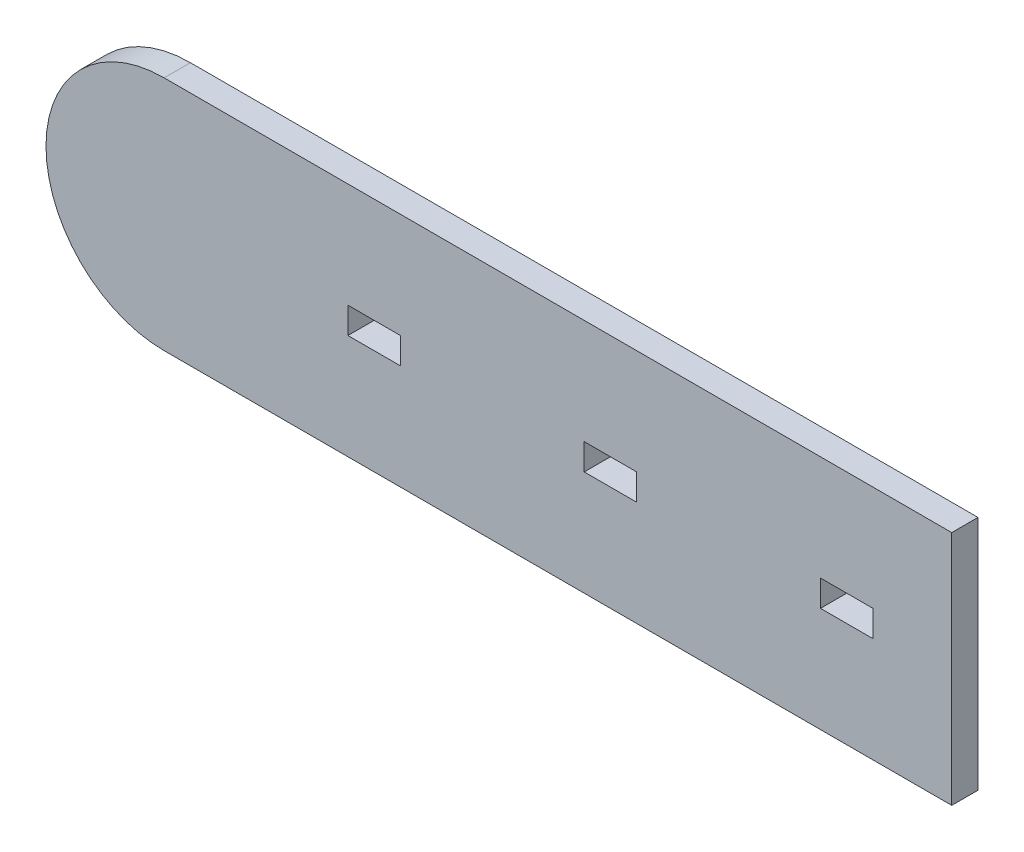
ISO-10303-21;
HEADER;
FILE_DESCRIPTION(('STEP AP214'),'2;1');
FILE_NAME('part.step','',(''),(''),'','','');
FILE_SCHEMA(('AUTOMOTIVE_DESIGN { 1 0 10303 214 1 1 1 1 }'));
ENDSEC;
DATA;
#1=APPLICATION_CONTEXT('core data for automotive mechanical design processes');
#2=APPLICATION_PROTOCOL_DEFINITION('international standard','automotive_design',2000,#1);
#3=PRODUCT_CONTEXT('',#1,'mechanical');
#4=PRODUCT('Part','Part','',(#3));
#5=PRODUCT_RELATED_PRODUCT_CATEGORY('part','',(#4));
#6=PRODUCT_DEFINITION_FORMATION('','',#4);
#7=PRODUCT_DEFINITION_CONTEXT('part definition',#1,'design');
#8=PRODUCT_DEFINITION('design','',#6,#7);
#9=PRODUCT_DEFINITION_SHAPE('','',#8);
#10=(LENGTH_UNIT() NAMED_UNIT(*) SI_UNIT(.MILLI.,.METRE.));
#11=(NAMED_UNIT(*) PLANE_ANGLE_UNIT() SI_UNIT($,.RADIAN.));
#12=(NAMED_UNIT(*) SI_UNIT($,.STERADIAN.) SOLID_ANGLE_UNIT());
#13=UNCERTAINTY_MEASURE_WITH_UNIT(LENGTH_MEASURE(1.E-05),#10,'distance_accuracy_value','');
#14=(GEOMETRIC_REPRESENTATION_CONTEXT(3) GLOBAL_UNCERTAINTY_ASSIGNED_CONTEXT((#13)) GLOBAL_UNIT_ASSIGNED_CONTEXT((#10,
#11,#12)) REPRESENTATION_CONTEXT('',''));
#15=CARTESIAN_POINT('',(0.,0.,0.));
#16=DIRECTION('',(0.,0.,1.));
#17=DIRECTION('',(1.,0.,0.));
#18=AXIS2_PLACEMENT_3D('',#15,#16,#17);
#19=CARTESIAN_POINT('',(35.,0.,5.));
#20=DIRECTION('',(1.,0.,0.));
#21=DIRECTION('',(0.,0.,-1.));
#22=AXIS2_PLACEMENT_3D('',#19,#20,#21);
#23=PLANE('',#22);
#24=DIRECTION('',(0.,-1.,0.));
#25=VECTOR('',#24,1.);
#26=CARTESIAN_POINT('',(35.,0.,0.));
#27=LINE('',#26,#25);
#28=CARTESIAN_POINT('',(35.,2.5,0.));
#29=VERTEX_POINT('',#28);
#30=CARTESIAN_POINT('',(35.,-2.5,0.));
#31=VERTEX_POINT('',#30);
#32=EDGE_CURVE('E251',#29,#31,#27,.T.);
#33=ORIENTED_EDGE('',*,*,#32,.F.);
#34=DIRECTION('',(0.,0.,-1.));
#35=VECTOR('',#34,1.);
#36=CARTESIAN_POINT('',(35.,2.5,5.));
#37=LINE('',#36,#35);
#38=CARTESIAN_POINT('',(35.,2.5,5.));
#39=VERTEX_POINT('',#38);
#40=EDGE_CURVE('E11',#39,#29,#37,.T.);
#41=ORIENTED_EDGE('',*,*,#40,.F.);
#42=DIRECTION('',(0.,-1.,0.));
#43=VECTOR('',#42,1.);
#44=CARTESIAN_POINT('',(35.,0.,5.));
#45=LINE('',#44,#43);
#46=CARTESIAN_POINT('',(35.,-2.5,5.));
#47=VERTEX_POINT('',#46);
#48=EDGE_CURVE('E168',#39,#47,#45,.T.);
#49=ORIENTED_EDGE('',*,*,#48,.T.);
#50=DIRECTION('',(0.,0.,-1.));
#51=VECTOR('',#50,1.);
#52=CARTESIAN_POINT('',(35.,-2.5,5.));
#53=LINE('',#52,#51);
#54=EDGE_CURVE('E54',#47,#31,#53,.T.);
#55=ORIENTED_EDGE('',*,*,#54,.T.);
#56=EDGE_LOOP('',(#33,#41,#49,#55));
#57=FACE_BOUND('',#56,.T.);
#58=ADVANCED_FACE('F35',(#57),#23,.T.);
#59=CARTESIAN_POINT('',(0.,2.5,5.));
#60=DIRECTION('',(0.,1.,0.));
#61=DIRECTION('',(0.,0.,1.));
#62=AXIS2_PLACEMENT_3D('',#59,#60,#61);
#63=PLANE('',#62);
#64=DIRECTION('',(1.,0.,0.));
#65=VECTOR('',#64,1.);
#66=CARTESIAN_POINT('',(0.,2.5,0.));
#67=LINE('',#66,#65);
#68=CARTESIAN_POINT('',(45.,2.5,0.));
#69=VERTEX_POINT('',#68);
#70=EDGE_CURVE('E173',#29,#69,#67,.T.);
#71=ORIENTED_EDGE('',*,*,#70,.T.);
#72=DIRECTION('',(0.,0.,-1.));
#73=VECTOR('',#72,1.);
#74=CARTESIAN_POINT('',(45.,2.5,5.));
#75=LINE('',#74,#73);
#76=CARTESIAN_POINT('',(45.,2.5,5.));
#77=VERTEX_POINT('',#76);
#78=EDGE_CURVE('E45',#77,#69,#75,.T.);
#79=ORIENTED_EDGE('',*,*,#78,.F.);
#80=DIRECTION('',(1.,0.,0.));
#81=VECTOR('',#80,1.);
#82=CARTESIAN_POINT('',(0.,2.5,5.));
#83=LINE('',#82,#81);
#84=EDGE_CURVE('E163',#39,#77,#83,.T.);
#85=ORIENTED_EDGE('',*,*,#84,.F.);
#86=ORIENTED_EDGE('',*,*,#40,.T.);
#87=EDGE_LOOP('',(#71,#79,#85,#86));
#88=FACE_BOUND('',#87,.T.);
#89=ADVANCED_FACE('F171',(#88),#63,.F.);
#90=CARTESIAN_POINT('',(45.,0.,5.));
#91=DIRECTION('',(1.,0.,0.));
#92=DIRECTION('',(0.,0.,-1.));
#93=AXIS2_PLACEMENT_3D('',#90,#91,#92);
#94=PLANE('',#93);
#95=DIRECTION('',(0.,-1.,0.));
#96=VECTOR('',#95,1.);
#97=CARTESIAN_POINT('',(45.,0.,0.));
#98=LINE('',#97,#96);
#99=CARTESIAN_POINT('',(45.,-2.5,0.));
#100=VERTEX_POINT('',#99);
#101=EDGE_CURVE('E254',#69,#100,#98,.T.);
#102=ORIENTED_EDGE('',*,*,#101,.T.);
#103=DIRECTION('',(0.,0.,-1.));
#104=VECTOR('',#103,1.);
#105=CARTESIAN_POINT('',(45.,-2.5,5.));
#106=LINE('',#105,#104);
#107=CARTESIAN_POINT('',(45.,-2.5,5.));
#108=VERTEX_POINT('',#107);
#109=EDGE_CURVE('E104',#108,#100,#106,.T.);
#110=ORIENTED_EDGE('',*,*,#109,.F.);
#111=DIRECTION('',(0.,-1.,0.));
#112=VECTOR('',#111,1.);
#113=CARTESIAN_POINT('',(45.,0.,5.));
#114=LINE('',#113,#112);
#115=EDGE_CURVE('E155',#77,#108,#114,.T.);
#116=ORIENTED_EDGE('',*,*,#115,.F.);
#117=ORIENTED_EDGE('',*,*,#78,.T.);
#118=EDGE_LOOP('',(#102,#110,#116,#117));
#119=FACE_BOUND('',#118,.T.);
#120=ADVANCED_FACE('F157',(#119),#94,.F.);
#121=CARTESIAN_POINT('',(0.,-22.5,5.));
#122=DIRECTION('',(0.,1.,0.));
#123=DIRECTION('',(0.,0.,1.));
#124=AXIS2_PLACEMENT_3D('',#121,#122,#123);
#125=PLANE('',#124);
#126=DIRECTION('',(1.,0.,0.));
#127=VECTOR('',#126,1.);
#128=CARTESIAN_POINT('',(0.,-22.5,0.));
#129=LINE('',#128,#127);
#130=CARTESIAN_POINT('',(0.,-22.5,0.));
#131=VERTEX_POINT('',#130);
#132=CARTESIAN_POINT('',(150.,-22.5,0.));
#133=VERTEX_POINT('',#132);
#134=EDGE_CURVE('E240',#131,#133,#129,.T.);
#135=ORIENTED_EDGE('',*,*,#134,.T.);
#136=DIRECTION('',(0.,0.,-1.));
#137=VECTOR('',#136,1.);
#138=CARTESIAN_POINT('',(150.,-22.5,5.));
#139=LINE('',#138,#137);
#140=CARTESIAN_POINT('',(150.,-22.5,5.));
#141=VERTEX_POINT('',#140);
#142=EDGE_CURVE('E186',#141,#133,#139,.T.);
#143=ORIENTED_EDGE('',*,*,#142,.F.);
#144=DIRECTION('',(1.,0.,0.));
#145=VECTOR('',#144,1.);
#146=CARTESIAN_POINT('',(0.,-22.5,5.));
#147=LINE('',#146,#145);
#148=CARTESIAN_POINT('',(0.,-22.5,5.));
#149=VERTEX_POINT('',#148);
#150=EDGE_CURVE('E278',#149,#141,#147,.T.);
#151=ORIENTED_EDGE('',*,*,#150,.F.);
#152=DIRECTION('',(0.,0.,-1.));
#153=VECTOR('',#152,1.);
#154=CARTESIAN_POINT('',(0.,-22.5,5.));
#155=LINE('',#154,#153);
#156=EDGE_CURVE('E178',#149,#131,#155,.T.);
#157=ORIENTED_EDGE('',*,*,#156,.T.);
#158=EDGE_LOOP('',(#135,#143,#151,#157));
#159=FACE_BOUND('',#158,.T.);
#160=ADVANCED_FACE('F323',(#159),#125,.F.);
#161=CARTESIAN_POINT('',(150.,0.,5.));
#162=DIRECTION('',(1.,0.,0.));
#163=DIRECTION('',(0.,0.,-1.));
#164=AXIS2_PLACEMENT_3D('',#161,#162,#163);
#165=PLANE('',#164);
#166=DIRECTION('',(0.,-1.,0.));
#167=VECTOR('',#166,1.);
#168=CARTESIAN_POINT('',(150.,0.,0.));
#169=LINE('',#168,#167);
#170=CARTESIAN_POINT('',(150.,22.5,0.));
#171=VERTEX_POINT('',#170);
#172=EDGE_CURVE('E243',#171,#133,#169,.T.);
#173=ORIENTED_EDGE('',*,*,#172,.F.);
#174=DIRECTION('',(0.,0.,-1.));
#175=VECTOR('',#174,1.);
#176=CARTESIAN_POINT('',(150.,22.5,5.));
#177=LINE('',#176,#175);
#178=CARTESIAN_POINT('',(150.,22.5,5.));
#179=VERTEX_POINT('',#178);
#180=EDGE_CURVE('E184',#179,#171,#177,.T.);
#181=ORIENTED_EDGE('',*,*,#180,.F.);
#182=DIRECTION('',(0.,-1.,0.));
#183=VECTOR('',#182,1.);
#184=CARTESIAN_POINT('',(150.,0.,5.));
#185=LINE('',#184,#183);
#186=EDGE_CURVE('E280',#179,#141,#185,.T.);
#187=ORIENTED_EDGE('',*,*,#186,.T.);
#188=ORIENTED_EDGE('',*,*,#142,.T.);
#189=EDGE_LOOP('',(#173,#181,#187,#188));
#190=FACE_BOUND('',#189,.T.);
#191=ADVANCED_FACE('F319',(#190),#165,.T.);
#192=CARTESIAN_POINT('',(0.,22.5,5.));
#193=DIRECTION('',(0.,1.,0.));
#194=DIRECTION('',(0.,0.,1.));
#195=AXIS2_PLACEMENT_3D('',#192,#193,#194);
#196=PLANE('',#195);
#197=DIRECTION('',(1.,0.,0.));
#198=VECTOR('',#197,1.);
#199=CARTESIAN_POINT('',(0.,22.5,0.));
#200=LINE('',#199,#198);
#201=CARTESIAN_POINT('',(0.,22.5,0.));
#202=VERTEX_POINT('',#201);
#203=EDGE_CURVE('E246',#202,#171,#200,.T.);
#204=ORIENTED_EDGE('',*,*,#203,.F.);
#205=DIRECTION('',(0.,0.,-1.));
#206=VECTOR('',#205,1.);
#207=CARTESIAN_POINT('',(0.,22.5,5.));
#208=LINE('',#207,#206);
#209=CARTESIAN_POINT('',(0.,22.5,5.));
#210=VERTEX_POINT('',#209);
#211=EDGE_CURVE('E181',#210,#202,#208,.T.);
#212=ORIENTED_EDGE('',*,*,#211,.F.);
#213=DIRECTION('',(1.,0.,0.));
#214=VECTOR('',#213,1.);
#215=CARTESIAN_POINT('',(0.,22.5,5.));
#216=LINE('',#215,#214);
#217=EDGE_CURVE('E283',#210,#179,#216,.T.);
#218=ORIENTED_EDGE('',*,*,#217,.T.);
#219=ORIENTED_EDGE('',*,*,#180,.T.);
#220=EDGE_LOOP('',(#204,#212,#218,#219));
#221=FACE_BOUND('',#220,.T.);
#222=ADVANCED_FACE('F315',(#221),#196,.T.);
#223=CARTESIAN_POINT('',(0.,-2.5,5.));
#224=DIRECTION('',(0.,1.,0.));
#225=DIRECTION('',(0.,0.,1.));
#226=AXIS2_PLACEMENT_3D('',#223,#224,#225);
#227=PLANE('',#226);
#228=DIRECTION('',(1.,0.,0.));
#229=VECTOR('',#228,1.);
#230=CARTESIAN_POINT('',(0.,-2.5,0.));
#231=LINE('',#230,#229);
#232=CARTESIAN_POINT('',(125.,-2.5,0.));
#233=VERTEX_POINT('',#232);
#234=CARTESIAN_POINT('',(135.,-2.5,0.));
#235=VERTEX_POINT('',#234);
#236=EDGE_CURVE('E228',#233,#235,#231,.T.);
#237=ORIENTED_EDGE('',*,*,#236,.F.);
#238=DIRECTION('',(0.,0.,-1.));
#239=VECTOR('',#238,1.);
#240=CARTESIAN_POINT('',(125.,-2.5,5.));
#241=LINE('',#240,#239);
#242=CARTESIAN_POINT('',(125.,-2.5,5.));
#243=VERTEX_POINT('',#242);
#244=EDGE_CURVE('E182',#243,#233,#241,.T.);
#245=ORIENTED_EDGE('',*,*,#244,.F.);
#246=DIRECTION('',(1.,0.,0.));
#247=VECTOR('',#246,1.);
#248=CARTESIAN_POINT('',(0.,-2.5,5.));
#249=LINE('',#248,#247);
#250=CARTESIAN_POINT('',(135.,-2.5,5.));
#251=VERTEX_POINT('',#250);
#252=EDGE_CURVE('E267',#243,#251,#249,.T.);
#253=ORIENTED_EDGE('',*,*,#252,.T.);
#254=DIRECTION('',(0.,0.,-1.));
#255=VECTOR('',#254,1.);
#256=CARTESIAN_POINT('',(135.,-2.5,5.));
#257=LINE('',#256,#255);
#258=EDGE_CURVE('E188',#251,#235,#257,.T.);
#259=ORIENTED_EDGE('',*,*,#258,.T.);
#260=EDGE_LOOP('',(#237,#245,#253,#259));
#261=FACE_BOUND('',#260,.T.);
#262=ADVANCED_FACE('F318',(#261),#227,.T.);
#263=CARTESIAN_POINT('',(125.,0.,5.));
#264=DIRECTION('',(1.,0.,0.));
#265=DIRECTION('',(0.,0.,-1.));
#266=AXIS2_PLACEMENT_3D('',#263,#264,#265);
#267=PLANE('',#266);
#268=DIRECTION('',(0.,-1.,0.));
#269=VECTOR('',#268,1.);
#270=CARTESIAN_POINT('',(125.,0.,0.));
#271=LINE('',#270,#269);
#272=CARTESIAN_POINT('',(125.,2.5,0.));
#273=VERTEX_POINT('',#272);
#274=EDGE_CURVE('E231',#273,#233,#271,.T.);
#275=ORIENTED_EDGE('',*,*,#274,.F.);
#276=DIRECTION('',(0.,0.,-1.));
#277=VECTOR('',#276,1.);
#278=CARTESIAN_POINT('',(125.,2.5,5.));
#279=LINE('',#278,#277);
#280=CARTESIAN_POINT('',(125.,2.5,5.));
#281=VERTEX_POINT('',#280);
#282=EDGE_CURVE('E193',#281,#273,#279,.T.);
#283=ORIENTED_EDGE('',*,*,#282,.F.);
#284=DIRECTION('',(0.,-1.,0.));
#285=VECTOR('',#284,1.);
#286=CARTESIAN_POINT('',(125.,0.,5.));
#287=LINE('',#286,#285);
#288=EDGE_CURVE('E270',#281,#243,#287,.T.);
#289=ORIENTED_EDGE('',*,*,#288,.T.);
#290=ORIENTED_EDGE('',*,*,#244,.T.);
#291=EDGE_LOOP('',(#275,#283,#289,#290));
#292=FACE_BOUND('',#291,.T.);
#293=ADVANCED_FACE('F334',(#292),#267,.T.);
#294=CARTESIAN_POINT('',(0.,2.5,5.));
#295=DIRECTION('',(0.,1.,0.));
#296=DIRECTION('',(0.,0.,1.));
#297=AXIS2_PLACEMENT_3D('',#294,#295,#296);
#298=PLANE('',#297);
#299=DIRECTION('',(1.,0.,0.));
#300=VECTOR('',#299,1.);
#301=CARTESIAN_POINT('',(0.,2.5,0.));
#302=LINE('',#301,#300);
#303=CARTESIAN_POINT('',(135.,2.5,0.));
#304=VERTEX_POINT('',#303);
#305=EDGE_CURVE('E234',#273,#304,#302,.T.);
#306=ORIENTED_EDGE('',*,*,#305,.T.);
#307=DIRECTION('',(0.,0.,-1.));
#308=VECTOR('',#307,1.);
#309=CARTESIAN_POINT('',(135.,2.5,5.));
#310=LINE('',#309,#308);
#311=CARTESIAN_POINT('',(135.,2.5,5.));
#312=VERTEX_POINT('',#311);
#313=EDGE_CURVE('E190',#312,#304,#310,.T.);
#314=ORIENTED_EDGE('',*,*,#313,.F.);
#315=DIRECTION('',(1.,0.,0.));
#316=VECTOR('',#315,1.);
#317=CARTESIAN_POINT('',(0.,2.5,5.));
#318=LINE('',#317,#316);
#319=EDGE_CURVE('E273',#281,#312,#318,.T.);
#320=ORIENTED_EDGE('',*,*,#319,.F.);
#321=ORIENTED_EDGE('',*,*,#282,.T.);
#322=EDGE_LOOP('',(#306,#314,#320,#321));
#323=FACE_BOUND('',#322,.T.);
#324=ADVANCED_FACE('F331',(#323),#298,.F.);
#325=CARTESIAN_POINT('',(0.,-2.5,5.));
#326=DIRECTION('',(0.,1.,0.));
#327=DIRECTION('',(0.,0.,1.));
#328=AXIS2_PLACEMENT_3D('',#325,#326,#327);
#329=PLANE('',#328);
#330=DIRECTION('',(1.,0.,0.));
#331=VECTOR('',#330,1.);
#332=CARTESIAN_POINT('',(0.,-2.5,0.));
#333=LINE('',#332,#331);
#334=CARTESIAN_POINT('',(80.,-2.5,0.));
#335=VERTEX_POINT('',#334);
#336=CARTESIAN_POINT('',(90.,-2.5,0.));
#337=VERTEX_POINT('',#336);
#338=EDGE_CURVE('E213',#335,#337,#333,.T.);
#339=ORIENTED_EDGE('',*,*,#338,.F.);
#340=DIRECTION('',(0.,0.,-1.));
#341=VECTOR('',#340,1.);
#342=CARTESIAN_POINT('',(80.,-2.5,5.));
#343=LINE('',#342,#341);
#344=CARTESIAN_POINT('',(80.,-2.5,5.));
#345=VERTEX_POINT('',#344);
#346=EDGE_CURVE('E39',#345,#335,#343,.T.);
#347=ORIENTED_EDGE('',*,*,#346,.F.);
#348=DIRECTION('',(1.,0.,0.));
#349=VECTOR('',#348,1.);
#350=CARTESIAN_POINT('',(0.,-2.5,5.));
#351=LINE('',#350,#349);
#352=CARTESIAN_POINT('',(90.,-2.5,5.));
#353=VERTEX_POINT('',#352);
#354=EDGE_CURVE('E258',#345,#353,#351,.T.);
#355=ORIENTED_EDGE('',*,*,#354,.T.);
#356=DIRECTION('',(0.,0.,-1.));
#357=VECTOR('',#356,1.);
#358=CARTESIAN_POINT('',(90.,-2.5,5.));
#359=LINE('',#358,#357);
#360=EDGE_CURVE('E196',#353,#337,#359,.T.);
#361=ORIENTED_EDGE('',*,*,#360,.T.);
#362=EDGE_LOOP('',(#339,#347,#355,#361));
#363=FACE_BOUND('',#362,.T.);
#364=ADVANCED_FACE('F37',(#363),#329,.T.);
#365=CARTESIAN_POINT('',(80.,0.,5.));
#366=DIRECTION('',(1.,0.,0.));
#367=DIRECTION('',(0.,0.,-1.));
#368=AXIS2_PLACEMENT_3D('',#365,#366,#367);
#369=PLANE('',#368);
#370=DIRECTION('',(0.,-1.,0.));
#371=VECTOR('',#370,1.);
#372=CARTESIAN_POINT('',(80.,0.,0.));
#373=LINE('',#372,#371);
#374=CARTESIAN_POINT('',(80.,2.5,0.));
#375=VERTEX_POINT('',#374);
#376=EDGE_CURVE('E209',#375,#335,#373,.T.);
#377=ORIENTED_EDGE('',*,*,#376,.F.);
#378=DIRECTION('',(0.,0.,-1.));
#379=VECTOR('',#378,1.);
#380=CARTESIAN_POINT('',(80.,2.5,5.));
#381=LINE('',#380,#379);
#382=CARTESIAN_POINT('',(80.,2.5,5.));
#383=VERTEX_POINT('',#382);
#384=EDGE_CURVE('E200',#383,#375,#381,.T.);
#385=ORIENTED_EDGE('',*,*,#384,.F.);
#386=DIRECTION('',(0.,-1.,0.));
#387=VECTOR('',#386,1.);
#388=CARTESIAN_POINT('',(80.,0.,5.));
#389=LINE('',#388,#387);
#390=EDGE_CURVE('E211',#383,#345,#389,.T.);
#391=ORIENTED_EDGE('',*,*,#390,.T.);
#392=ORIENTED_EDGE('',*,*,#346,.T.);
#393=EDGE_LOOP('',(#377,#385,#391,#392));
#394=FACE_BOUND('',#393,.T.);
#395=ADVANCED_FACE('F207',(#394),#369,.T.);
#396=CARTESIAN_POINT('',(0.,2.5,5.));
#397=DIRECTION('',(0.,1.,0.));
#398=DIRECTION('',(0.,0.,1.));
#399=AXIS2_PLACEMENT_3D('',#396,#397,#398);
#400=PLANE('',#399);
#401=DIRECTION('',(1.,0.,0.));
#402=VECTOR('',#401,1.);
#403=CARTESIAN_POINT('',(0.,2.5,0.));
#404=LINE('',#403,#402);
#405=CARTESIAN_POINT('',(90.,2.5,0.));
#406=VERTEX_POINT('',#405);
#407=EDGE_CURVE('E221',#375,#406,#404,.T.);
#408=ORIENTED_EDGE('',*,*,#407,.T.);
#409=DIRECTION('',(0.,0.,-1.));
#410=VECTOR('',#409,1.);
#411=CARTESIAN_POINT('',(90.,2.5,5.));
#412=LINE('',#411,#410);
#413=CARTESIAN_POINT('',(90.,2.5,5.));
#414=VERTEX_POINT('',#413);
#415=EDGE_CURVE('E198',#414,#406,#412,.T.);
#416=ORIENTED_EDGE('',*,*,#415,.F.);
#417=DIRECTION('',(1.,0.,0.));
#418=VECTOR('',#417,1.);
#419=CARTESIAN_POINT('',(0.,2.5,5.));
#420=LINE('',#419,#418);
#421=EDGE_CURVE('E261',#383,#414,#420,.T.);
#422=ORIENTED_EDGE('',*,*,#421,.F.);
#423=ORIENTED_EDGE('',*,*,#384,.T.);
#424=EDGE_LOOP('',(#408,#416,#422,#423));
#425=FACE_BOUND('',#424,.T.);
#426=ADVANCED_FACE('F313',(#425),#400,.F.);
#427=CARTESIAN_POINT('',(0.,0.,5.));
#428=DIRECTION('',(0.,0.,-1.));
#429=DIRECTION('',(-1.,0.,0.));
#430=AXIS2_PLACEMENT_3D('',#427,#428,#429);
#431=CYLINDRICAL_SURFACE('',#430,22.5);
#432=CARTESIAN_POINT('',(0.,0.,0.));
#433=DIRECTION('',(0.,0.,1.));
#434=DIRECTION('',(1.,0.,0.));
#435=AXIS2_PLACEMENT_3D('',#432,#433,#434);
#436=CIRCLE('',#435,22.5);
#437=EDGE_CURVE('E249',#202,#131,#436,.T.);
#438=ORIENTED_EDGE('',*,*,#437,.T.);
#439=ORIENTED_EDGE('',*,*,#156,.F.);
#440=CARTESIAN_POINT('',(0.,0.,5.));
#441=DIRECTION('',(0.,0.,1.));
#442=DIRECTION('',(1.,0.,0.));
#443=AXIS2_PLACEMENT_3D('',#440,#441,#442);
#444=CIRCLE('',#443,22.5);
#445=EDGE_CURVE('E286',#210,#149,#444,.T.);
#446=ORIENTED_EDGE('',*,*,#445,.F.);
#447=ORIENTED_EDGE('',*,*,#211,.T.);
#448=EDGE_LOOP('',(#438,#439,#446,#447));
#449=FACE_BOUND('',#448,.T.);
#450=ADVANCED_FACE('F310',(#449),#431,.T.);
#451=CARTESIAN_POINT('',(135.,0.,5.));
#452=DIRECTION('',(1.,0.,0.));
#453=DIRECTION('',(0.,0.,-1.));
#454=AXIS2_PLACEMENT_3D('',#451,#452,#453);
#455=PLANE('',#454);
#456=DIRECTION('',(0.,-1.,0.));
#457=VECTOR('',#456,1.);
#458=CARTESIAN_POINT('',(135.,0.,0.));
#459=LINE('',#458,#457);
#460=EDGE_CURVE('E237',#304,#235,#459,.T.);
#461=ORIENTED_EDGE('',*,*,#460,.T.);
#462=ORIENTED_EDGE('',*,*,#258,.F.);
#463=DIRECTION('',(0.,-1.,0.));
#464=VECTOR('',#463,1.);
#465=CARTESIAN_POINT('',(135.,0.,5.));
#466=LINE('',#465,#464);
#467=EDGE_CURVE('E276',#312,#251,#466,.T.);
#468=ORIENTED_EDGE('',*,*,#467,.F.);
#469=ORIENTED_EDGE('',*,*,#313,.T.);
#470=EDGE_LOOP('',(#461,#462,#468,#469));
#471=FACE_BOUND('',#470,.T.);
#472=ADVANCED_FACE('F298',(#471),#455,.F.);
#473=CARTESIAN_POINT('',(90.,0.,5.));
#474=DIRECTION('',(1.,0.,0.));
#475=DIRECTION('',(0.,0.,-1.));
#476=AXIS2_PLACEMENT_3D('',#473,#474,#475);
#477=PLANE('',#476);
#478=DIRECTION('',(0.,-1.,0.));
#479=VECTOR('',#478,1.);
#480=CARTESIAN_POINT('',(90.,0.,0.));
#481=LINE('',#480,#479);
#482=EDGE_CURVE('E223',#406,#337,#481,.T.);
#483=ORIENTED_EDGE('',*,*,#482,.T.);
#484=ORIENTED_EDGE('',*,*,#360,.F.);
#485=DIRECTION('',(0.,-1.,0.));
#486=VECTOR('',#485,1.);
#487=CARTESIAN_POINT('',(90.,0.,5.));
#488=LINE('',#487,#486);
#489=EDGE_CURVE('E265',#414,#353,#488,.T.);
#490=ORIENTED_EDGE('',*,*,#489,.F.);
#491=ORIENTED_EDGE('',*,*,#415,.T.);
#492=EDGE_LOOP('',(#483,#484,#490,#491));
#493=FACE_BOUND('',#492,.T.);
#494=ADVANCED_FACE('F290',(#493),#477,.F.);
#495=CARTESIAN_POINT('',(0.,-2.5,5.));
#496=DIRECTION('',(0.,1.,0.));
#497=DIRECTION('',(0.,0.,1.));
#498=AXIS2_PLACEMENT_3D('',#495,#496,#497);
#499=PLANE('',#498);
#500=DIRECTION('',(1.,0.,0.));
#501=VECTOR('',#500,1.);
#502=CARTESIAN_POINT('',(0.,-2.5,0.));
#503=LINE('',#502,#501);
#504=EDGE_CURVE('E256',#31,#100,#503,.T.);
#505=ORIENTED_EDGE('',*,*,#504,.F.);
#506=ORIENTED_EDGE('',*,*,#54,.F.);
#507=DIRECTION('',(1.,0.,0.));
#508=VECTOR('',#507,1.);
#509=CARTESIAN_POINT('',(0.,-2.5,5.));
#510=LINE('',#509,#508);
#511=EDGE_CURVE('E162',#47,#108,#510,.T.);
#512=ORIENTED_EDGE('',*,*,#511,.T.);
#513=ORIENTED_EDGE('',*,*,#109,.T.);
#514=EDGE_LOOP('',(#505,#506,#512,#513));
#515=FACE_BOUND('',#514,.T.);
#516=ADVANCED_FACE('F288',(#515),#499,.T.);
#517=CARTESIAN_POINT('',(0.,0.,5.));
#518=DIRECTION('',(0.,0.,1.));
#519=DIRECTION('',(1.,0.,0.));
#520=AXIS2_PLACEMENT_3D('',#517,#518,#519);
#521=PLANE('',#520);
#522=ORIENTED_EDGE('',*,*,#354,.F.);
#523=ORIENTED_EDGE('',*,*,#390,.F.);
#524=ORIENTED_EDGE('',*,*,#421,.T.);
#525=ORIENTED_EDGE('',*,*,#489,.T.);
#526=EDGE_LOOP('',(#522,#523,#524,#525));
#527=FACE_BOUND('',#526,.T.);
#528=ORIENTED_EDGE('',*,*,#252,.F.);
#529=ORIENTED_EDGE('',*,*,#288,.F.);
#530=ORIENTED_EDGE('',*,*,#319,.T.);
#531=ORIENTED_EDGE('',*,*,#467,.T.);
#532=EDGE_LOOP('',(#528,#529,#530,#531));
#533=FACE_BOUND('',#532,.T.);
#534=ORIENTED_EDGE('',*,*,#150,.T.);
#535=ORIENTED_EDGE('',*,*,#186,.F.);
#536=ORIENTED_EDGE('',*,*,#217,.F.);
#537=ORIENTED_EDGE('',*,*,#445,.T.);
#538=EDGE_LOOP('',(#534,#535,#536,#537));
#539=FACE_BOUND('',#538,.T.);
#540=ORIENTED_EDGE('',*,*,#48,.F.);
#541=ORIENTED_EDGE('',*,*,#84,.T.);
#542=ORIENTED_EDGE('',*,*,#115,.T.);
#543=ORIENTED_EDGE('',*,*,#511,.F.);
#544=EDGE_LOOP('',(#540,#541,#542,#543));
#545=FACE_BOUND('',#544,.T.);
#546=ADVANCED_FACE('F167',(#527,#533,#539,#545),#521,.T.);
#547=CARTESIAN_POINT('',(0.,0.,0.));
#548=DIRECTION('',(0.,0.,1.));
#549=DIRECTION('',(1.,0.,0.));
#550=AXIS2_PLACEMENT_3D('',#547,#548,#549);
#551=PLANE('',#550);
#552=ORIENTED_EDGE('',*,*,#338,.T.);
#553=ORIENTED_EDGE('',*,*,#482,.F.);
#554=ORIENTED_EDGE('',*,*,#407,.F.);
#555=ORIENTED_EDGE('',*,*,#376,.T.);
#556=EDGE_LOOP('',(#552,#553,#554,#555));
#557=FACE_BOUND('',#556,.T.);
#558=ORIENTED_EDGE('',*,*,#236,.T.);
#559=ORIENTED_EDGE('',*,*,#460,.F.);
#560=ORIENTED_EDGE('',*,*,#305,.F.);
#561=ORIENTED_EDGE('',*,*,#274,.T.);
#562=EDGE_LOOP('',(#558,#559,#560,#561));
#563=FACE_BOUND('',#562,.T.);
#564=ORIENTED_EDGE('',*,*,#134,.F.);
#565=ORIENTED_EDGE('',*,*,#437,.F.);
#566=ORIENTED_EDGE('',*,*,#203,.T.);
#567=ORIENTED_EDGE('',*,*,#172,.T.);
#568=EDGE_LOOP('',(#564,#565,#566,#567));
#569=FACE_BOUND('',#568,.T.);
#570=ORIENTED_EDGE('',*,*,#32,.T.);
#571=ORIENTED_EDGE('',*,*,#504,.T.);
#572=ORIENTED_EDGE('',*,*,#101,.F.);
#573=ORIENTED_EDGE('',*,*,#70,.F.);
#574=EDGE_LOOP('',(#570,#571,#572,#573));
#575=FACE_BOUND('',#574,.T.);
#576=ADVANCED_FACE('F219',(#557,#563,#569,#575),#551,.F.);
#577=CLOSED_SHELL('',(#58,#89,#120,#160,#191,#222,#262,#293,#324,#364,#395,#426,#450,#472,#494,
#516,#546,#576));
#578=MANIFOLD_SOLID_BREP('B2',#577);
#579=ADVANCED_BREP_SHAPE_REPRESENTATION('',(#18,#578),#14);
#580=SHAPE_DEFINITION_REPRESENTATION(#9,#579);
ENDSEC;
END-ISO-10303-21;
